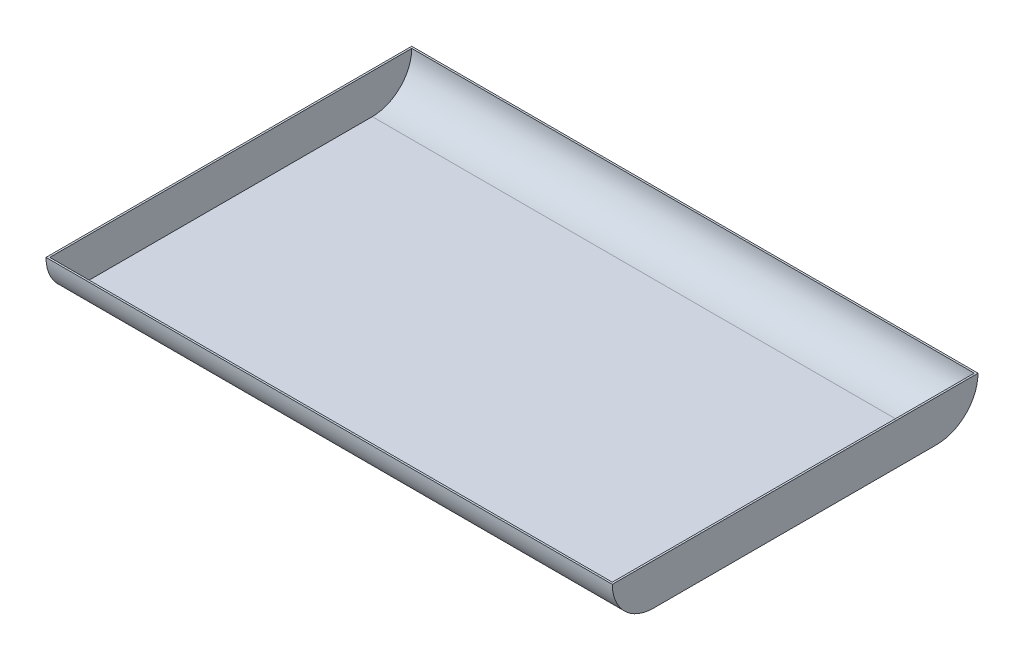
ISO-10303-21;
HEADER;
FILE_DESCRIPTION(('STEP AP214'),'2;1');
FILE_NAME('part.step','',(''),(''),'','','');
FILE_SCHEMA(('AUTOMOTIVE_DESIGN { 1 0 10303 214 1 1 1 1 }'));
ENDSEC;
DATA;
#1=APPLICATION_CONTEXT('core data for automotive mechanical design processes');
#2=APPLICATION_PROTOCOL_DEFINITION('international standard','automotive_design',2000,#1);
#3=PRODUCT_CONTEXT('',#1,'mechanical');
#4=PRODUCT('Part','Part','',(#3));
#5=PRODUCT_RELATED_PRODUCT_CATEGORY('part','',(#4));
#6=PRODUCT_DEFINITION_FORMATION('','',#4);
#7=PRODUCT_DEFINITION_CONTEXT('part definition',#1,'design');
#8=PRODUCT_DEFINITION('design','',#6,#7);
#9=PRODUCT_DEFINITION_SHAPE('','',#8);
#10=(LENGTH_UNIT() NAMED_UNIT(*) SI_UNIT(.MILLI.,.METRE.));
#11=(NAMED_UNIT(*) PLANE_ANGLE_UNIT() SI_UNIT($,.RADIAN.));
#12=(NAMED_UNIT(*) SI_UNIT($,.STERADIAN.) SOLID_ANGLE_UNIT());
#13=UNCERTAINTY_MEASURE_WITH_UNIT(LENGTH_MEASURE(1.E-05),#10,'distance_accuracy_value','');
#14=(GEOMETRIC_REPRESENTATION_CONTEXT(3) GLOBAL_UNCERTAINTY_ASSIGNED_CONTEXT((#13)) GLOBAL_UNIT_ASSIGNED_CONTEXT((#10,
#11,#12)) REPRESENTATION_CONTEXT('',''));
#15=CARTESIAN_POINT('',(0.,0.,0.));
#16=DIRECTION('',(0.,0.,1.));
#17=DIRECTION('',(1.,0.,0.));
#18=AXIS2_PLACEMENT_3D('',#15,#16,#17);
#19=CARTESIAN_POINT('',(-304.8,44.45,196.85));
#20=DIRECTION('',(0.,-1.,0.));
#21=DIRECTION('',(0.,0.,-1.));
#22=AXIS2_PLACEMENT_3D('',#19,#20,#21);
#23=PLANE('',#22);
#24=DIRECTION('',(1.,0.,0.));
#25=VECTOR('',#24,1.);
#26=CARTESIAN_POINT('',(-304.8,44.45,196.85));
#27=LINE('',#26,#25);
#28=CARTESIAN_POINT('',(-304.8,44.45,196.85));
#29=VERTEX_POINT('',#28);
#30=CARTESIAN_POINT('',(304.8,44.45,196.85));
#31=VERTEX_POINT('',#30);
#32=EDGE_CURVE('E11',#29,#31,#27,.T.);
#33=ORIENTED_EDGE('',*,*,#32,.T.);
#34=DIRECTION('',(0.,0.,-1.));
#35=VECTOR('',#34,1.);
#36=CARTESIAN_POINT('',(304.8,44.45,196.85));
#37=LINE('',#36,#35);
#38=CARTESIAN_POINT('',(304.8,44.45,-196.85));
#39=VERTEX_POINT('',#38);
#40=EDGE_CURVE('E148',#31,#39,#37,.T.);
#41=ORIENTED_EDGE('',*,*,#40,.T.);
#42=DIRECTION('',(1.,0.,0.));
#43=VECTOR('',#42,1.);
#44=CARTESIAN_POINT('',(-304.8,44.45,-196.85));
#45=LINE('',#44,#43);
#46=CARTESIAN_POINT('',(-304.8,44.45,-196.85));
#47=VERTEX_POINT('',#46);
#48=EDGE_CURVE('E47',#47,#39,#45,.T.);
#49=ORIENTED_EDGE('',*,*,#48,.F.);
#50=DIRECTION('',(0.,0.,-1.));
#51=VECTOR('',#50,1.);
#52=CARTESIAN_POINT('',(-304.8,44.45,196.85));
#53=LINE('',#52,#51);
#54=EDGE_CURVE('E160',#29,#47,#53,.T.);
#55=ORIENTED_EDGE('',*,*,#54,.F.);
#56=EDGE_LOOP('',(#33,#41,#49,#55));
#57=FACE_BOUND('',#56,.T.);
#58=DIRECTION('',(1.,0.,0.));
#59=VECTOR('',#58,1.);
#60=CARTESIAN_POINT('',(-302.8,44.45,194.85));
#61=LINE('',#60,#59);
#62=CARTESIAN_POINT('',(-302.8,44.45,194.85));
#63=VERTEX_POINT('',#62);
#64=CARTESIAN_POINT('',(302.8,44.45,194.85));
#65=VERTEX_POINT('',#64);
#66=EDGE_CURVE('E128',#63,#65,#61,.T.);
#67=ORIENTED_EDGE('',*,*,#66,.F.);
#68=DIRECTION('',(0.,0.,-1.));
#69=VECTOR('',#68,1.);
#70=CARTESIAN_POINT('',(-302.8,44.45,196.85));
#71=LINE('',#70,#69);
#72=CARTESIAN_POINT('',(-302.8,44.45,-194.85));
#73=VERTEX_POINT('',#72);
#74=EDGE_CURVE('E134',#63,#73,#71,.T.);
#75=ORIENTED_EDGE('',*,*,#74,.T.);
#76=DIRECTION('',(1.,0.,0.));
#77=VECTOR('',#76,1.);
#78=CARTESIAN_POINT('',(-302.8,44.45,-194.85));
#79=LINE('',#78,#77);
#80=CARTESIAN_POINT('',(302.8,44.45,-194.85));
#81=VERTEX_POINT('',#80);
#82=EDGE_CURVE('E135',#73,#81,#79,.T.);
#83=ORIENTED_EDGE('',*,*,#82,.T.);
#84=DIRECTION('',(0.,0.,-1.));
#85=VECTOR('',#84,1.);
#86=CARTESIAN_POINT('',(302.8,44.45,196.85));
#87=LINE('',#86,#85);
#88=EDGE_CURVE('E129',#65,#81,#87,.T.);
#89=ORIENTED_EDGE('',*,*,#88,.F.);
#90=EDGE_LOOP('',(#67,#75,#83,#89));
#91=FACE_BOUND('',#90,.T.);
#92=ADVANCED_FACE('F39',(#57,#91),#23,.F.);
#93=CARTESIAN_POINT('',(-304.8,44.45,152.4));
#94=DIRECTION('',(1.,0.,0.));
#95=DIRECTION('',(0.,0.,-1.));
#96=AXIS2_PLACEMENT_3D('',#93,#94,#95);
#97=CYLINDRICAL_SURFACE('',#96,44.45);
#98=DIRECTION('',(1.,0.,0.));
#99=VECTOR('',#98,1.);
#100=CARTESIAN_POINT('',(-304.8,0.,152.4));
#101=LINE('',#100,#99);
#102=CARTESIAN_POINT('',(-304.8,0.,152.4));
#103=VERTEX_POINT('',#102);
#104=CARTESIAN_POINT('',(304.8,0.,152.4));
#105=VERTEX_POINT('',#104);
#106=EDGE_CURVE('E62',#103,#105,#101,.T.);
#107=ORIENTED_EDGE('',*,*,#106,.T.);
#108=CARTESIAN_POINT('',(304.8,44.45,152.4));
#109=DIRECTION('',(-1.,0.,0.));
#110=DIRECTION('',(0.,0.,1.));
#111=AXIS2_PLACEMENT_3D('',#108,#109,#110);
#112=CIRCLE('',#111,44.45);
#113=EDGE_CURVE('E140',#105,#31,#112,.T.);
#114=ORIENTED_EDGE('',*,*,#113,.T.);
#115=ORIENTED_EDGE('',*,*,#32,.F.);
#116=CARTESIAN_POINT('',(-304.8,44.45,152.4));
#117=DIRECTION('',(-1.,0.,0.));
#118=DIRECTION('',(0.,0.,1.));
#119=AXIS2_PLACEMENT_3D('',#116,#117,#118);
#120=CIRCLE('',#119,44.45);
#121=EDGE_CURVE('E157',#103,#29,#120,.T.);
#122=ORIENTED_EDGE('',*,*,#121,.F.);
#123=EDGE_LOOP('',(#107,#114,#115,#122));
#124=FACE_BOUND('',#123,.T.);
#125=ADVANCED_FACE('F41',(#124),#97,.T.);
#126=CARTESIAN_POINT('',(-304.8,44.45,-152.4));
#127=DIRECTION('',(1.,0.,0.));
#128=DIRECTION('',(0.,0.,-1.));
#129=AXIS2_PLACEMENT_3D('',#126,#127,#128);
#130=CYLINDRICAL_SURFACE('',#129,44.45);
#131=ORIENTED_EDGE('',*,*,#48,.T.);
#132=CARTESIAN_POINT('',(304.8,44.45,-152.4));
#133=DIRECTION('',(1.,0.,0.));
#134=DIRECTION('',(0.,0.,-1.));
#135=AXIS2_PLACEMENT_3D('',#132,#133,#134);
#136=CIRCLE('',#135,44.45);
#137=CARTESIAN_POINT('',(304.8,0.,-152.4));
#138=VERTEX_POINT('',#137);
#139=EDGE_CURVE('E151',#138,#39,#136,.T.);
#140=ORIENTED_EDGE('',*,*,#139,.F.);
#141=DIRECTION('',(1.,0.,0.));
#142=VECTOR('',#141,1.);
#143=CARTESIAN_POINT('',(-304.8,0.,-152.4));
#144=LINE('',#143,#142);
#145=CARTESIAN_POINT('',(-304.8,0.,-152.4));
#146=VERTEX_POINT('',#145);
#147=EDGE_CURVE('E168',#146,#138,#144,.T.);
#148=ORIENTED_EDGE('',*,*,#147,.F.);
#149=CARTESIAN_POINT('',(-304.8,44.45,-152.4));
#150=DIRECTION('',(1.,0.,0.));
#151=DIRECTION('',(0.,0.,-1.));
#152=AXIS2_PLACEMENT_3D('',#149,#150,#151);
#153=CIRCLE('',#152,44.45);
#154=EDGE_CURVE('E162',#146,#47,#153,.T.);
#155=ORIENTED_EDGE('',*,*,#154,.T.);
#156=EDGE_LOOP('',(#131,#140,#148,#155));
#157=FACE_BOUND('',#156,.T.);
#158=ADVANCED_FACE('F172',(#157),#130,.T.);
#159=CARTESIAN_POINT('',(-304.8,0.,152.4));
#160=DIRECTION('',(0.,-1.,0.));
#161=DIRECTION('',(0.,0.,-1.));
#162=AXIS2_PLACEMENT_3D('',#159,#160,#161);
#163=PLANE('',#162);
#164=ORIENTED_EDGE('',*,*,#147,.T.);
#165=DIRECTION('',(0.,0.,-1.));
#166=VECTOR('',#165,1.);
#167=CARTESIAN_POINT('',(304.8,0.,152.4));
#168=LINE('',#167,#166);
#169=EDGE_CURVE('E154',#105,#138,#168,.T.);
#170=ORIENTED_EDGE('',*,*,#169,.F.);
#171=ORIENTED_EDGE('',*,*,#106,.F.);
#172=DIRECTION('',(0.,0.,-1.));
#173=VECTOR('',#172,1.);
#174=CARTESIAN_POINT('',(-304.8,0.,152.4));
#175=LINE('',#174,#173);
#176=EDGE_CURVE('E165',#103,#146,#175,.T.);
#177=ORIENTED_EDGE('',*,*,#176,.T.);
#178=EDGE_LOOP('',(#164,#170,#171,#177));
#179=FACE_BOUND('',#178,.T.);
#180=ADVANCED_FACE('F183',(#179),#163,.T.);
#181=CARTESIAN_POINT('',(-304.8,44.45,152.4));
#182=DIRECTION('',(-1.,0.,0.));
#183=DIRECTION('',(0.,0.,1.));
#184=AXIS2_PLACEMENT_3D('',#181,#182,#183);
#185=PLANE('',#184);
#186=ORIENTED_EDGE('',*,*,#121,.T.);
#187=ORIENTED_EDGE('',*,*,#54,.T.);
#188=ORIENTED_EDGE('',*,*,#154,.F.);
#189=ORIENTED_EDGE('',*,*,#176,.F.);
#190=EDGE_LOOP('',(#186,#187,#188,#189));
#191=FACE_BOUND('',#190,.T.);
#192=ADVANCED_FACE('F185',(#191),#185,.T.);
#193=CARTESIAN_POINT('',(304.8,44.45,152.4));
#194=DIRECTION('',(-1.,0.,0.));
#195=DIRECTION('',(0.,0.,1.));
#196=AXIS2_PLACEMENT_3D('',#193,#194,#195);
#197=PLANE('',#196);
#198=ORIENTED_EDGE('',*,*,#113,.F.);
#199=ORIENTED_EDGE('',*,*,#169,.T.);
#200=ORIENTED_EDGE('',*,*,#139,.T.);
#201=ORIENTED_EDGE('',*,*,#40,.F.);
#202=EDGE_LOOP('',(#198,#199,#200,#201));
#203=FACE_BOUND('',#202,.T.);
#204=ADVANCED_FACE('F178',(#203),#197,.F.);
#205=CARTESIAN_POINT('',(-304.8,44.45,152.4));
#206=DIRECTION('',(1.,0.,0.));
#207=DIRECTION('',(0.,0.,-1.));
#208=AXIS2_PLACEMENT_3D('',#205,#206,#207);
#209=CYLINDRICAL_SURFACE('',#208,42.45);
#210=DIRECTION('',(1.,0.,0.));
#211=VECTOR('',#210,1.);
#212=CARTESIAN_POINT('',(-304.8,2.00000000000003,152.4));
#213=LINE('',#212,#211);
#214=CARTESIAN_POINT('',(-302.8,2.00000000000003,152.4));
#215=VERTEX_POINT('',#214);
#216=CARTESIAN_POINT('',(302.8,2.00000000000003,152.4));
#217=VERTEX_POINT('',#216);
#218=EDGE_CURVE('E105',#215,#217,#213,.T.);
#219=ORIENTED_EDGE('',*,*,#218,.F.);
#220=CARTESIAN_POINT('',(-302.8,44.45,152.4));
#221=DIRECTION('',(-1.,0.,0.));
#222=DIRECTION('',(0.,0.,1.));
#223=AXIS2_PLACEMENT_3D('',#220,#221,#222);
#224=CIRCLE('',#223,42.45);
#225=EDGE_CURVE('E124',#215,#63,#224,.T.);
#226=ORIENTED_EDGE('',*,*,#225,.T.);
#227=ORIENTED_EDGE('',*,*,#66,.T.);
#228=CARTESIAN_POINT('',(302.8,44.45,152.4));
#229=DIRECTION('',(-1.,0.,0.));
#230=DIRECTION('',(0.,0.,1.));
#231=AXIS2_PLACEMENT_3D('',#228,#229,#230);
#232=CIRCLE('',#231,42.45);
#233=EDGE_CURVE('E121',#217,#65,#232,.T.);
#234=ORIENTED_EDGE('',*,*,#233,.F.);
#235=EDGE_LOOP('',(#219,#226,#227,#234));
#236=FACE_BOUND('',#235,.T.);
#237=ADVANCED_FACE('F126',(#236),#209,.F.);
#238=CARTESIAN_POINT('',(-304.8,44.45,-152.4));
#239=DIRECTION('',(1.,0.,0.));
#240=DIRECTION('',(0.,0.,-1.));
#241=AXIS2_PLACEMENT_3D('',#238,#239,#240);
#242=CYLINDRICAL_SURFACE('',#241,42.45);
#243=ORIENTED_EDGE('',*,*,#82,.F.);
#244=CARTESIAN_POINT('',(-302.8,44.45,-152.4));
#245=DIRECTION('',(-1.,0.,0.));
#246=DIRECTION('',(0.,0.,1.));
#247=AXIS2_PLACEMENT_3D('',#244,#245,#246);
#248=CIRCLE('',#247,42.45);
#249=CARTESIAN_POINT('',(-302.8,2.,-152.4));
#250=VERTEX_POINT('',#249);
#251=EDGE_CURVE('E54',#250,#73,#248,.F.);
#252=ORIENTED_EDGE('',*,*,#251,.F.);
#253=DIRECTION('',(1.,0.,0.));
#254=VECTOR('',#253,1.);
#255=CARTESIAN_POINT('',(-304.8,2.,-152.4));
#256=LINE('',#255,#254);
#257=CARTESIAN_POINT('',(302.8,2.,-152.4));
#258=VERTEX_POINT('',#257);
#259=EDGE_CURVE('E115',#250,#258,#256,.T.);
#260=ORIENTED_EDGE('',*,*,#259,.T.);
#261=CARTESIAN_POINT('',(302.8,44.45,-152.4));
#262=DIRECTION('',(-1.,0.,0.));
#263=DIRECTION('',(0.,0.,1.));
#264=AXIS2_PLACEMENT_3D('',#261,#262,#263);
#265=CIRCLE('',#264,42.45);
#266=EDGE_CURVE('E123',#258,#81,#265,.F.);
#267=ORIENTED_EDGE('',*,*,#266,.T.);
#268=EDGE_LOOP('',(#243,#252,#260,#267));
#269=FACE_BOUND('',#268,.T.);
#270=ADVANCED_FACE('F235',(#269),#242,.F.);
#271=CARTESIAN_POINT('',(-304.8,2.,152.4));
#272=DIRECTION('',(0.,-1.,0.));
#273=DIRECTION('',(0.,0.,-1.));
#274=AXIS2_PLACEMENT_3D('',#271,#272,#273);
#275=PLANE('',#274);
#276=ORIENTED_EDGE('',*,*,#259,.F.);
#277=DIRECTION('',(0.,0.,-1.));
#278=VECTOR('',#277,1.);
#279=CARTESIAN_POINT('',(-302.8,2.,152.4));
#280=LINE('',#279,#278);
#281=EDGE_CURVE('E110',#215,#250,#280,.T.);
#282=ORIENTED_EDGE('',*,*,#281,.F.);
#283=ORIENTED_EDGE('',*,*,#218,.T.);
#284=DIRECTION('',(0.,0.,-1.));
#285=VECTOR('',#284,1.);
#286=CARTESIAN_POINT('',(302.8,2.,152.4));
#287=LINE('',#286,#285);
#288=EDGE_CURVE('E108',#217,#258,#287,.T.);
#289=ORIENTED_EDGE('',*,*,#288,.T.);
#290=EDGE_LOOP('',(#276,#282,#283,#289));
#291=FACE_BOUND('',#290,.T.);
#292=ADVANCED_FACE('F107',(#291),#275,.F.);
#293=CARTESIAN_POINT('',(-302.8,44.45,152.4));
#294=DIRECTION('',(-1.,0.,0.));
#295=DIRECTION('',(0.,0.,1.));
#296=AXIS2_PLACEMENT_3D('',#293,#294,#295);
#297=PLANE('',#296);
#298=ORIENTED_EDGE('',*,*,#225,.F.);
#299=ORIENTED_EDGE('',*,*,#281,.T.);
#300=ORIENTED_EDGE('',*,*,#251,.T.);
#301=ORIENTED_EDGE('',*,*,#74,.F.);
#302=EDGE_LOOP('',(#298,#299,#300,#301));
#303=FACE_BOUND('',#302,.T.);
#304=ADVANCED_FACE('F254',(#303),#297,.F.);
#305=CARTESIAN_POINT('',(302.8,44.45,152.4));
#306=DIRECTION('',(-1.,0.,0.));
#307=DIRECTION('',(0.,0.,1.));
#308=AXIS2_PLACEMENT_3D('',#305,#306,#307);
#309=PLANE('',#308);
#310=ORIENTED_EDGE('',*,*,#233,.T.);
#311=ORIENTED_EDGE('',*,*,#88,.T.);
#312=ORIENTED_EDGE('',*,*,#266,.F.);
#313=ORIENTED_EDGE('',*,*,#288,.F.);
#314=EDGE_LOOP('',(#310,#311,#312,#313));
#315=FACE_BOUND('',#314,.T.);
#316=ADVANCED_FACE('F119',(#315),#309,.T.);
#317=CLOSED_SHELL('',(#92,#125,#158,#180,#192,#204,#237,#270,#292,#304,#316));
#318=MANIFOLD_SOLID_BREP('B2',#317);
#319=ADVANCED_BREP_SHAPE_REPRESENTATION('',(#18,#318),#14);
#320=SHAPE_DEFINITION_REPRESENTATION(#9,#319);
ENDSEC;
END-ISO-10303-21;
